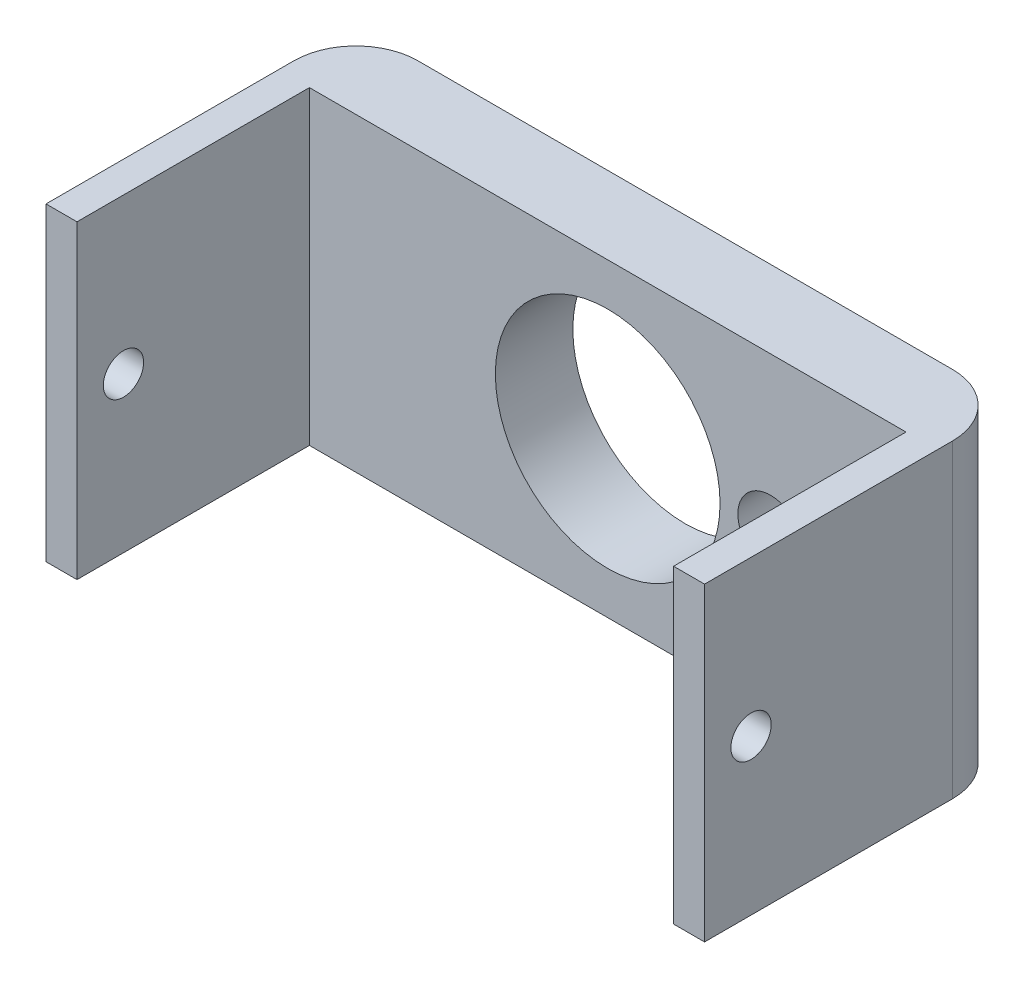
ISO-10303-21;
HEADER;
FILE_DESCRIPTION(('STEP AP214'),'2;1');
FILE_NAME('part.step','',(''),(''),'','','');
FILE_SCHEMA(('AUTOMOTIVE_DESIGN { 1 0 10303 214 1 1 1 1 }'));
ENDSEC;
DATA;
#1=APPLICATION_CONTEXT('core data for automotive mechanical design processes');
#2=APPLICATION_PROTOCOL_DEFINITION('international standard','automotive_design',2000,#1);
#3=PRODUCT_CONTEXT('',#1,'mechanical');
#4=PRODUCT('Part','Part','',(#3));
#5=PRODUCT_RELATED_PRODUCT_CATEGORY('part','',(#4));
#6=PRODUCT_DEFINITION_FORMATION('','',#4);
#7=PRODUCT_DEFINITION_CONTEXT('part definition',#1,'design');
#8=PRODUCT_DEFINITION('design','',#6,#7);
#9=PRODUCT_DEFINITION_SHAPE('','',#8);
#10=(LENGTH_UNIT() NAMED_UNIT(*) SI_UNIT(.MILLI.,.METRE.));
#11=(NAMED_UNIT(*) PLANE_ANGLE_UNIT() SI_UNIT($,.RADIAN.));
#12=(NAMED_UNIT(*) SI_UNIT($,.STERADIAN.) SOLID_ANGLE_UNIT());
#13=UNCERTAINTY_MEASURE_WITH_UNIT(LENGTH_MEASURE(1.E-05),#10,'distance_accuracy_value','');
#14=(GEOMETRIC_REPRESENTATION_CONTEXT(3) GLOBAL_UNCERTAINTY_ASSIGNED_CONTEXT((#13)) GLOBAL_UNIT_ASSIGNED_CONTEXT((#10,
#11,#12)) REPRESENTATION_CONTEXT('',''));
#15=CARTESIAN_POINT('',(0.,0.,0.));
#16=DIRECTION('',(0.,0.,1.));
#17=DIRECTION('',(1.,0.,0.));
#18=AXIS2_PLACEMENT_3D('',#15,#16,#17);
#19=CARTESIAN_POINT('',(0.,0.,20.));
#20=DIRECTION('',(0.,0.,-1.));
#21=DIRECTION('',(-1.,0.,0.));
#22=AXIS2_PLACEMENT_3D('',#19,#20,#21);
#23=PLANE('',#22);
#24=DIRECTION('',(-1.,0.,0.));
#25=VECTOR('',#24,1.);
#26=CARTESIAN_POINT('',(-21.25,10.,20.));
#27=LINE('',#26,#25);
#28=CARTESIAN_POINT('',(21.25,10.,20.));
#29=VERTEX_POINT('',#28);
#30=CARTESIAN_POINT('',(19.25,10.,20.));
#31=VERTEX_POINT('',#30);
#32=EDGE_CURVE('E167',#29,#31,#27,.T.);
#33=ORIENTED_EDGE('',*,*,#32,.T.);
#34=DIRECTION('',(0.,1.,0.));
#35=VECTOR('',#34,1.);
#36=CARTESIAN_POINT('',(19.25,10.,20.));
#37=LINE('',#36,#35);
#38=CARTESIAN_POINT('',(19.25,-10.,20.));
#39=VERTEX_POINT('',#38);
#40=EDGE_CURVE('E145',#39,#31,#37,.T.);
#41=ORIENTED_EDGE('',*,*,#40,.F.);
#42=DIRECTION('',(1.,0.,0.));
#43=VECTOR('',#42,1.);
#44=CARTESIAN_POINT('',(-21.25,-10.,20.));
#45=LINE('',#44,#43);
#46=CARTESIAN_POINT('',(21.25,-10.,20.));
#47=VERTEX_POINT('',#46);
#48=EDGE_CURVE('E151',#39,#47,#45,.T.);
#49=ORIENTED_EDGE('',*,*,#48,.T.);
#50=DIRECTION('',(0.,1.,0.));
#51=VECTOR('',#50,1.);
#52=CARTESIAN_POINT('',(21.25,-10.,20.));
#53=LINE('',#52,#51);
#54=EDGE_CURVE('E161',#47,#29,#53,.T.);
#55=ORIENTED_EDGE('',*,*,#54,.T.);
#56=EDGE_LOOP('',(#33,#41,#49,#55));
#57=FACE_BOUND('',#56,.T.);
#58=ADVANCED_FACE('F45',(#57),#23,.F.);
#59=CARTESIAN_POINT('',(21.25,-10.,20.));
#60=DIRECTION('',(-1.,0.,0.));
#61=DIRECTION('',(0.,0.,1.));
#62=AXIS2_PLACEMENT_3D('',#59,#60,#61);
#63=PLANE('',#62);
#64=CARTESIAN_POINT('',(21.25,0.,17.));
#65=DIRECTION('',(1.,0.,0.));
#66=DIRECTION('',(0.,0.,-1.));
#67=AXIS2_PLACEMENT_3D('',#64,#65,#66);
#68=CIRCLE('',#67,1.3);
#69=CARTESIAN_POINT('',(21.25,0.,15.7));
#70=VERTEX_POINT('',#69);
#71=EDGE_CURVE('E277',#70,#70,#68,.T.);
#72=ORIENTED_EDGE('',*,*,#71,.F.);
#73=EDGE_LOOP('',(#72));
#74=FACE_BOUND('',#73,.T.);
#75=DIRECTION('',(0.,0.,-1.));
#76=VECTOR('',#75,1.);
#77=CARTESIAN_POINT('',(21.25,-10.,20.));
#78=LINE('',#77,#76);
#79=CARTESIAN_POINT('',(21.25,-10.,4.));
#80=VERTEX_POINT('',#79);
#81=EDGE_CURVE('E178',#47,#80,#78,.T.);
#82=ORIENTED_EDGE('',*,*,#81,.T.);
#83=DIRECTION('',(0.,1.,0.));
#84=VECTOR('',#83,1.);
#85=CARTESIAN_POINT('',(21.25,10.,4.));
#86=LINE('',#85,#84);
#87=CARTESIAN_POINT('',(21.25,10.,4.));
#88=VERTEX_POINT('',#87);
#89=EDGE_CURVE('E12',#80,#88,#86,.T.);
#90=ORIENTED_EDGE('',*,*,#89,.T.);
#91=DIRECTION('',(0.,0.,-1.));
#92=VECTOR('',#91,1.);
#93=CARTESIAN_POINT('',(21.25,10.,20.));
#94=LINE('',#93,#92);
#95=EDGE_CURVE('E194',#29,#88,#94,.T.);
#96=ORIENTED_EDGE('',*,*,#95,.F.);
#97=ORIENTED_EDGE('',*,*,#54,.F.);
#98=EDGE_LOOP('',(#82,#90,#96,#97));
#99=FACE_BOUND('',#98,.T.);
#100=ADVANCED_FACE('F238',(#74,#99),#63,.F.);
#101=CARTESIAN_POINT('',(-21.25,10.,20.));
#102=DIRECTION('',(0.,-1.,0.));
#103=DIRECTION('',(0.,0.,-1.));
#104=AXIS2_PLACEMENT_3D('',#101,#102,#103);
#105=PLANE('',#104);
#106=DIRECTION('',(-1.,0.,0.));
#107=VECTOR('',#106,1.);
#108=CARTESIAN_POINT('',(-21.25,10.,0.));
#109=LINE('',#108,#107);
#110=CARTESIAN_POINT('',(17.25,10.,0.));
#111=VERTEX_POINT('',#110);
#112=CARTESIAN_POINT('',(-17.25,10.,0.));
#113=VERTEX_POINT('',#112);
#114=EDGE_CURVE('E160',#111,#113,#109,.T.);
#115=ORIENTED_EDGE('',*,*,#114,.T.);
#116=CARTESIAN_POINT('',(-17.25,10.,4.));
#117=DIRECTION('',(0.,-1.,0.));
#118=DIRECTION('',(0.,0.,-1.));
#119=AXIS2_PLACEMENT_3D('',#116,#117,#118);
#120=CIRCLE('',#119,4.);
#121=CARTESIAN_POINT('',(-21.25,10.,4.));
#122=VERTEX_POINT('',#121);
#123=EDGE_CURVE('E54',#113,#122,#120,.F.);
#124=ORIENTED_EDGE('',*,*,#123,.T.);
#125=DIRECTION('',(0.,0.,-1.));
#126=VECTOR('',#125,1.);
#127=CARTESIAN_POINT('',(-21.25,10.,20.));
#128=LINE('',#127,#126);
#129=CARTESIAN_POINT('',(-21.25,10.,20.));
#130=VERTEX_POINT('',#129);
#131=EDGE_CURVE('E190',#130,#122,#128,.T.);
#132=ORIENTED_EDGE('',*,*,#131,.F.);
#133=CARTESIAN_POINT('',(-19.25,10.,20.));
#134=VERTEX_POINT('',#133);
#135=EDGE_CURVE('E165',#134,#130,#27,.T.);
#136=ORIENTED_EDGE('',*,*,#135,.F.);
#137=DIRECTION('',(0.,0.,1.));
#138=VECTOR('',#137,1.);
#139=CARTESIAN_POINT('',(-19.25,10.,-43.3849052090701));
#140=LINE('',#139,#138);
#141=CARTESIAN_POINT('',(-19.25,10.,5.));
#142=VERTEX_POINT('',#141);
#143=EDGE_CURVE('E245',#142,#134,#140,.T.);
#144=ORIENTED_EDGE('',*,*,#143,.F.);
#145=DIRECTION('',(-1.,0.,0.));
#146=VECTOR('',#145,1.);
#147=CARTESIAN_POINT('',(-19.25,10.,5.));
#148=LINE('',#147,#146);
#149=CARTESIAN_POINT('',(19.25,10.,5.));
#150=VERTEX_POINT('',#149);
#151=EDGE_CURVE('E248',#150,#142,#148,.T.);
#152=ORIENTED_EDGE('',*,*,#151,.F.);
#153=DIRECTION('',(0.,0.,1.));
#154=VECTOR('',#153,1.);
#155=CARTESIAN_POINT('',(19.25,10.,-43.3849052090701));
#156=LINE('',#155,#154);
#157=EDGE_CURVE('E131',#150,#31,#156,.T.);
#158=ORIENTED_EDGE('',*,*,#157,.T.);
#159=ORIENTED_EDGE('',*,*,#32,.F.);
#160=ORIENTED_EDGE('',*,*,#95,.T.);
#161=CARTESIAN_POINT('',(17.25,10.,4.));
#162=DIRECTION('',(0.,-1.,0.));
#163=DIRECTION('',(0.,0.,-1.));
#164=AXIS2_PLACEMENT_3D('',#161,#162,#163);
#165=CIRCLE('',#164,4.);
#166=EDGE_CURVE('E61',#88,#111,#165,.F.);
#167=ORIENTED_EDGE('',*,*,#166,.T.);
#168=EDGE_LOOP('',(#115,#124,#132,#136,#144,#152,#158,#159,#160,#167));
#169=FACE_BOUND('',#168,.T.);
#170=ADVANCED_FACE('F224',(#169),#105,.F.);
#171=CARTESIAN_POINT('',(-21.25,-10.,20.));
#172=DIRECTION('',(1.,0.,0.));
#173=DIRECTION('',(0.,0.,-1.));
#174=AXIS2_PLACEMENT_3D('',#171,#172,#173);
#175=PLANE('',#174);
#176=CARTESIAN_POINT('',(-21.25,0.,17.));
#177=DIRECTION('',(1.,0.,0.));
#178=DIRECTION('',(0.,0.,-1.));
#179=AXIS2_PLACEMENT_3D('',#176,#177,#178);
#180=CIRCLE('',#179,1.3);
#181=CARTESIAN_POINT('',(-21.25,0.,15.7));
#182=VERTEX_POINT('',#181);
#183=EDGE_CURVE('E204',#182,#182,#180,.F.);
#184=ORIENTED_EDGE('',*,*,#183,.F.);
#185=EDGE_LOOP('',(#184));
#186=FACE_BOUND('',#185,.T.);
#187=ORIENTED_EDGE('',*,*,#131,.T.);
#188=DIRECTION('',(0.,-1.,0.));
#189=VECTOR('',#188,1.);
#190=CARTESIAN_POINT('',(-21.25,-10.,4.));
#191=LINE('',#190,#189);
#192=CARTESIAN_POINT('',(-21.25,-10.,4.));
#193=VERTEX_POINT('',#192);
#194=EDGE_CURVE('E198',#122,#193,#191,.T.);
#195=ORIENTED_EDGE('',*,*,#194,.T.);
#196=DIRECTION('',(0.,0.,-1.));
#197=VECTOR('',#196,1.);
#198=CARTESIAN_POINT('',(-21.25,-10.,20.));
#199=LINE('',#198,#197);
#200=CARTESIAN_POINT('',(-21.25,-10.,20.));
#201=VERTEX_POINT('',#200);
#202=EDGE_CURVE('E187',#201,#193,#199,.T.);
#203=ORIENTED_EDGE('',*,*,#202,.F.);
#204=DIRECTION('',(0.,-1.,0.));
#205=VECTOR('',#204,1.);
#206=CARTESIAN_POINT('',(-21.25,-10.,20.));
#207=LINE('',#206,#205);
#208=EDGE_CURVE('E171',#130,#201,#207,.T.);
#209=ORIENTED_EDGE('',*,*,#208,.F.);
#210=EDGE_LOOP('',(#187,#195,#203,#209));
#211=FACE_BOUND('',#210,.T.);
#212=ADVANCED_FACE('F230',(#186,#211),#175,.F.);
#213=CARTESIAN_POINT('',(-21.25,-10.,20.));
#214=DIRECTION('',(0.,1.,0.));
#215=DIRECTION('',(0.,0.,1.));
#216=AXIS2_PLACEMENT_3D('',#213,#214,#215);
#217=PLANE('',#216);
#218=ORIENTED_EDGE('',*,*,#202,.T.);
#219=CARTESIAN_POINT('',(-17.25,-10.,4.));
#220=DIRECTION('',(0.,1.,0.));
#221=DIRECTION('',(0.,0.,1.));
#222=AXIS2_PLACEMENT_3D('',#219,#220,#221);
#223=CIRCLE('',#222,4.);
#224=CARTESIAN_POINT('',(-17.25,-10.,0.));
#225=VERTEX_POINT('',#224);
#226=EDGE_CURVE('E211',#193,#225,#223,.F.);
#227=ORIENTED_EDGE('',*,*,#226,.T.);
#228=DIRECTION('',(1.,0.,0.));
#229=VECTOR('',#228,1.);
#230=CARTESIAN_POINT('',(-21.25,-10.,0.));
#231=LINE('',#230,#229);
#232=CARTESIAN_POINT('',(17.25,-10.,0.));
#233=VERTEX_POINT('',#232);
#234=EDGE_CURVE('E166',#225,#233,#231,.T.);
#235=ORIENTED_EDGE('',*,*,#234,.T.);
#236=CARTESIAN_POINT('',(17.25,-10.,4.));
#237=DIRECTION('',(0.,1.,0.));
#238=DIRECTION('',(0.,0.,1.));
#239=AXIS2_PLACEMENT_3D('',#236,#237,#238);
#240=CIRCLE('',#239,4.);
#241=EDGE_CURVE('E208',#233,#80,#240,.F.);
#242=ORIENTED_EDGE('',*,*,#241,.T.);
#243=ORIENTED_EDGE('',*,*,#81,.F.);
#244=ORIENTED_EDGE('',*,*,#48,.F.);
#245=DIRECTION('',(0.,0.,1.));
#246=VECTOR('',#245,1.);
#247=CARTESIAN_POINT('',(19.25,-10.,-43.3849052090701));
#248=LINE('',#247,#246);
#249=CARTESIAN_POINT('',(19.25,-10.,5.));
#250=VERTEX_POINT('',#249);
#251=EDGE_CURVE('E128',#250,#39,#248,.T.);
#252=ORIENTED_EDGE('',*,*,#251,.F.);
#253=DIRECTION('',(1.,0.,0.));
#254=VECTOR('',#253,1.);
#255=CARTESIAN_POINT('',(-19.25,-10.,5.));
#256=LINE('',#255,#254);
#257=CARTESIAN_POINT('',(-19.25,-10.,5.));
#258=VERTEX_POINT('',#257);
#259=EDGE_CURVE('E138',#258,#250,#256,.T.);
#260=ORIENTED_EDGE('',*,*,#259,.F.);
#261=DIRECTION('',(0.,0.,1.));
#262=VECTOR('',#261,1.);
#263=CARTESIAN_POINT('',(-19.25,-10.,-43.3849052090701));
#264=LINE('',#263,#262);
#265=CARTESIAN_POINT('',(-19.25,-10.,20.));
#266=VERTEX_POINT('',#265);
#267=EDGE_CURVE('E157',#258,#266,#264,.T.);
#268=ORIENTED_EDGE('',*,*,#267,.T.);
#269=EDGE_CURVE('E174',#201,#266,#45,.T.);
#270=ORIENTED_EDGE('',*,*,#269,.F.);
#271=EDGE_LOOP('',(#218,#227,#235,#242,#243,#244,#252,#260,#268,#270));
#272=FACE_BOUND('',#271,.T.);
#273=ADVANCED_FACE('F149',(#272),#217,.F.);
#274=ORIENTED_EDGE('',*,*,#269,.T.);
#275=DIRECTION('',(0.,-1.,0.));
#276=VECTOR('',#275,1.);
#277=CARTESIAN_POINT('',(-19.25,10.,20.));
#278=LINE('',#277,#276);
#279=EDGE_CURVE('E255',#134,#266,#278,.T.);
#280=ORIENTED_EDGE('',*,*,#279,.F.);
#281=ORIENTED_EDGE('',*,*,#135,.T.);
#282=ORIENTED_EDGE('',*,*,#208,.T.);
#283=EDGE_LOOP('',(#274,#280,#281,#282));
#284=FACE_BOUND('',#283,.T.);
#285=ADVANCED_FACE('F257',(#284),#23,.F.);
#286=CARTESIAN_POINT('',(0.,0.,0.));
#287=DIRECTION('',(0.,0.,-1.));
#288=DIRECTION('',(-1.,0.,0.));
#289=AXIS2_PLACEMENT_3D('',#286,#287,#288);
#290=PLANE('',#289);
#291=CARTESIAN_POINT('',(10.5,0.,0.));
#292=DIRECTION('',(0.,0.,-1.));
#293=DIRECTION('',(-1.,0.,0.));
#294=AXIS2_PLACEMENT_3D('',#291,#292,#293);
#295=CIRCLE('',#294,2.1);
#296=CARTESIAN_POINT('',(8.4,0.,0.));
#297=VERTEX_POINT('',#296);
#298=EDGE_CURVE('E285',#297,#297,#295,.T.);
#299=ORIENTED_EDGE('',*,*,#298,.F.);
#300=EDGE_LOOP('',(#299));
#301=FACE_BOUND('',#300,.T.);
#302=CARTESIAN_POINT('',(0.,0.,0.));
#303=DIRECTION('',(0.,0.,-1.));
#304=DIRECTION('',(-1.,0.,0.));
#305=AXIS2_PLACEMENT_3D('',#302,#303,#304);
#306=CIRCLE('',#305,7.25);
#307=CARTESIAN_POINT('',(-7.25,0.,0.));
#308=VERTEX_POINT('',#307);
#309=EDGE_CURVE('E265',#308,#308,#306,.T.);
#310=ORIENTED_EDGE('',*,*,#309,.F.);
#311=EDGE_LOOP('',(#310));
#312=FACE_BOUND('',#311,.T.);
#313=ORIENTED_EDGE('',*,*,#234,.F.);
#314=DIRECTION('',(0.,-1.,0.));
#315=VECTOR('',#314,1.);
#316=CARTESIAN_POINT('',(-17.25,10.,0.));
#317=LINE('',#316,#315);
#318=EDGE_CURVE('E68',#225,#113,#317,.F.);
#319=ORIENTED_EDGE('',*,*,#318,.T.);
#320=ORIENTED_EDGE('',*,*,#114,.F.);
#321=DIRECTION('',(0.,1.,0.));
#322=VECTOR('',#321,1.);
#323=CARTESIAN_POINT('',(17.25,-10.,0.));
#324=LINE('',#323,#322);
#325=EDGE_CURVE('E214',#111,#233,#324,.F.);
#326=ORIENTED_EDGE('',*,*,#325,.T.);
#327=EDGE_LOOP('',(#313,#319,#320,#326));
#328=FACE_BOUND('',#327,.T.);
#329=ADVANCED_FACE('F235',(#301,#312,#328),#290,.T.);
#330=CARTESIAN_POINT('',(0.,0.,5.));
#331=DIRECTION('',(0.,0.,-1.));
#332=DIRECTION('',(-1.,0.,0.));
#333=AXIS2_PLACEMENT_3D('',#330,#331,#332);
#334=PLANE('',#333);
#335=CARTESIAN_POINT('',(10.5,0.,5.));
#336=DIRECTION('',(0.,0.,-1.));
#337=DIRECTION('',(-1.,0.,0.));
#338=AXIS2_PLACEMENT_3D('',#335,#336,#337);
#339=CIRCLE('',#338,2.1);
#340=CARTESIAN_POINT('',(8.4,0.,5.));
#341=VERTEX_POINT('',#340);
#342=EDGE_CURVE('E281',#341,#341,#339,.F.);
#343=ORIENTED_EDGE('',*,*,#342,.F.);
#344=EDGE_LOOP('',(#343));
#345=FACE_BOUND('',#344,.T.);
#346=CARTESIAN_POINT('',(0.,0.,5.));
#347=DIRECTION('',(0.,0.,-1.));
#348=DIRECTION('',(-1.,0.,0.));
#349=AXIS2_PLACEMENT_3D('',#346,#347,#348);
#350=CIRCLE('',#349,7.25);
#351=CARTESIAN_POINT('',(-7.25,0.,5.));
#352=VERTEX_POINT('',#351);
#353=EDGE_CURVE('E259',#352,#352,#350,.F.);
#354=ORIENTED_EDGE('',*,*,#353,.F.);
#355=EDGE_LOOP('',(#354));
#356=FACE_BOUND('',#355,.T.);
#357=DIRECTION('',(0.,-1.,0.));
#358=VECTOR('',#357,1.);
#359=CARTESIAN_POINT('',(-19.25,10.,5.));
#360=LINE('',#359,#358);
#361=EDGE_CURVE('E140',#142,#258,#360,.T.);
#362=ORIENTED_EDGE('',*,*,#361,.T.);
#363=ORIENTED_EDGE('',*,*,#259,.T.);
#364=DIRECTION('',(0.,1.,0.));
#365=VECTOR('',#364,1.);
#366=CARTESIAN_POINT('',(19.25,10.,5.));
#367=LINE('',#366,#365);
#368=EDGE_CURVE('E124',#250,#150,#367,.T.);
#369=ORIENTED_EDGE('',*,*,#368,.T.);
#370=ORIENTED_EDGE('',*,*,#151,.T.);
#371=EDGE_LOOP('',(#362,#363,#369,#370));
#372=FACE_BOUND('',#371,.T.);
#373=ADVANCED_FACE('F139',(#345,#356,#372),#334,.F.);
#374=CARTESIAN_POINT('',(19.25,10.,-43.3849052090701));
#375=DIRECTION('',(1.,0.,0.));
#376=DIRECTION('',(0.,0.,-1.));
#377=AXIS2_PLACEMENT_3D('',#374,#375,#376);
#378=PLANE('',#377);
#379=CARTESIAN_POINT('',(19.25,0.,17.));
#380=DIRECTION('',(1.,0.,0.));
#381=DIRECTION('',(0.,0.,-1.));
#382=AXIS2_PLACEMENT_3D('',#379,#380,#381);
#383=CIRCLE('',#382,1.3);
#384=CARTESIAN_POINT('',(19.25,0.,15.7));
#385=VERTEX_POINT('',#384);
#386=EDGE_CURVE('E203',#385,#385,#383,.T.);
#387=ORIENTED_EDGE('',*,*,#386,.T.);
#388=EDGE_LOOP('',(#387));
#389=FACE_BOUND('',#388,.T.);
#390=ORIENTED_EDGE('',*,*,#251,.T.);
#391=ORIENTED_EDGE('',*,*,#40,.T.);
#392=ORIENTED_EDGE('',*,*,#157,.F.);
#393=ORIENTED_EDGE('',*,*,#368,.F.);
#394=EDGE_LOOP('',(#390,#391,#392,#393));
#395=FACE_BOUND('',#394,.T.);
#396=ADVANCED_FACE('F126',(#389,#395),#378,.F.);
#397=CARTESIAN_POINT('',(-19.25,10.,-43.3849052090701));
#398=DIRECTION('',(-1.,0.,0.));
#399=DIRECTION('',(0.,-1.,0.));
#400=AXIS2_PLACEMENT_3D('',#397,#398,#399);
#401=PLANE('',#400);
#402=CARTESIAN_POINT('',(-19.25,0.,17.));
#403=DIRECTION('',(-1.,0.,0.));
#404=DIRECTION('',(0.,-1.,0.));
#405=AXIS2_PLACEMENT_3D('',#402,#403,#404);
#406=CIRCLE('',#405,1.3);
#407=CARTESIAN_POINT('',(-19.25,-1.3,17.));
#408=VERTEX_POINT('',#407);
#409=EDGE_CURVE('E199',#408,#408,#406,.T.);
#410=ORIENTED_EDGE('',*,*,#409,.T.);
#411=EDGE_LOOP('',(#410));
#412=FACE_BOUND('',#411,.T.);
#413=ORIENTED_EDGE('',*,*,#143,.T.);
#414=ORIENTED_EDGE('',*,*,#279,.T.);
#415=ORIENTED_EDGE('',*,*,#267,.F.);
#416=ORIENTED_EDGE('',*,*,#361,.F.);
#417=EDGE_LOOP('',(#413,#414,#415,#416));
#418=FACE_BOUND('',#417,.T.);
#419=ADVANCED_FACE('F254',(#412,#418),#401,.F.);
#420=CARTESIAN_POINT('',(0.,0.,25.5060966544099));
#421=DIRECTION('',(0.,0.,-1.));
#422=DIRECTION('',(-1.,0.,0.));
#423=AXIS2_PLACEMENT_3D('',#420,#421,#422);
#424=CYLINDRICAL_SURFACE('',#423,7.25);
#425=ORIENTED_EDGE('',*,*,#353,.T.);
#426=EDGE_LOOP('',(#425));
#427=FACE_BOUND('',#426,.T.);
#428=ORIENTED_EDGE('',*,*,#309,.T.);
#429=EDGE_LOOP('',(#428));
#430=FACE_BOUND('',#429,.T.);
#431=ADVANCED_FACE('F297',(#427,#430),#424,.F.);
#432=CARTESIAN_POINT('',(-24.92695526217,0.,17.));
#433=DIRECTION('',(1.,0.,0.));
#434=DIRECTION('',(0.,0.,-1.));
#435=AXIS2_PLACEMENT_3D('',#432,#433,#434);
#436=CYLINDRICAL_SURFACE('',#435,1.3);
#437=ORIENTED_EDGE('',*,*,#183,.T.);
#438=EDGE_LOOP('',(#437));
#439=FACE_BOUND('',#438,.T.);
#440=ORIENTED_EDGE('',*,*,#409,.F.);
#441=EDGE_LOOP('',(#440));
#442=FACE_BOUND('',#441,.T.);
#443=ADVANCED_FACE('F299',(#439,#442),#436,.F.);
#444=ORIENTED_EDGE('',*,*,#71,.T.);
#445=EDGE_LOOP('',(#444));
#446=FACE_BOUND('',#445,.T.);
#447=ORIENTED_EDGE('',*,*,#386,.F.);
#448=EDGE_LOOP('',(#447));
#449=FACE_BOUND('',#448,.T.);
#450=ADVANCED_FACE('F306',(#446,#449),#436,.F.);
#451=CARTESIAN_POINT('',(10.5,0.,10.939696961967));
#452=DIRECTION('',(0.,0.,-1.));
#453=DIRECTION('',(-1.,0.,0.));
#454=AXIS2_PLACEMENT_3D('',#451,#452,#453);
#455=CYLINDRICAL_SURFACE('',#454,2.1);
#456=CARTESIAN_POINT('',(8.4,0.,5.));
#457=CARTESIAN_POINT('',(8.4,0.,4.94791666666667));
#458=CARTESIAN_POINT('',(8.4,0.,4.89583333333333));
#459=CARTESIAN_POINT('',(8.4,0.,4.79166666666667));
#460=CARTESIAN_POINT('',(8.4,0.,4.73958333333333));
#461=CARTESIAN_POINT('',(8.4,0.,4.63541666666667));
#462=CARTESIAN_POINT('',(8.4,0.,4.58333333333333));
#463=CARTESIAN_POINT('',(8.4,0.,4.47916666666667));
#464=CARTESIAN_POINT('',(8.4,0.,4.42708333333333));
#465=CARTESIAN_POINT('',(8.4,0.,4.32291666666667));
#466=CARTESIAN_POINT('',(8.4,0.,4.27083333333333));
#467=CARTESIAN_POINT('',(8.4,0.,4.16666666666667));
#468=CARTESIAN_POINT('',(8.4,0.,4.11458333333333));
#469=CARTESIAN_POINT('',(8.4,0.,4.01041666666667));
#470=CARTESIAN_POINT('',(8.4,0.,3.95833333333333));
#471=CARTESIAN_POINT('',(8.4,0.,3.85416666666667));
#472=CARTESIAN_POINT('',(8.4,0.,3.80208333333333));
#473=CARTESIAN_POINT('',(8.4,0.,3.69791666666667));
#474=CARTESIAN_POINT('',(8.4,0.,3.64583333333333));
#475=CARTESIAN_POINT('',(8.4,0.,3.54166666666667));
#476=CARTESIAN_POINT('',(8.4,0.,3.48958333333333));
#477=CARTESIAN_POINT('',(8.4,0.,3.38541666666667));
#478=CARTESIAN_POINT('',(8.4,0.,3.33333333333333));
#479=CARTESIAN_POINT('',(8.4,0.,3.22916666666667));
#480=CARTESIAN_POINT('',(8.4,0.,3.17708333333333));
#481=CARTESIAN_POINT('',(8.4,0.,3.07291666666667));
#482=CARTESIAN_POINT('',(8.4,0.,3.02083333333333));
#483=CARTESIAN_POINT('',(8.4,0.,2.91666666666667));
#484=CARTESIAN_POINT('',(8.4,0.,2.86458333333333));
#485=CARTESIAN_POINT('',(8.4,0.,2.76041666666667));
#486=CARTESIAN_POINT('',(8.4,0.,2.70833333333333));
#487=CARTESIAN_POINT('',(8.4,0.,2.60416666666667));
#488=CARTESIAN_POINT('',(8.4,0.,2.55208333333333));
#489=CARTESIAN_POINT('',(8.4,0.,2.44791666666667));
#490=CARTESIAN_POINT('',(8.4,0.,2.39583333333333));
#491=CARTESIAN_POINT('',(8.4,0.,2.29166666666667));
#492=CARTESIAN_POINT('',(8.4,0.,2.23958333333333));
#493=CARTESIAN_POINT('',(8.4,0.,2.13541666666667));
#494=CARTESIAN_POINT('',(8.4,0.,2.08333333333334));
#495=CARTESIAN_POINT('',(8.4,0.,1.97916666666667));
#496=CARTESIAN_POINT('',(8.4,0.,1.92708333333334));
#497=CARTESIAN_POINT('',(8.4,0.,1.82291666666667));
#498=CARTESIAN_POINT('',(8.4,0.,1.77083333333334));
#499=CARTESIAN_POINT('',(8.4,0.,1.66666666666667));
#500=CARTESIAN_POINT('',(8.4,0.,1.61458333333333));
#501=CARTESIAN_POINT('',(8.4,0.,1.51041666666667));
#502=CARTESIAN_POINT('',(8.4,0.,1.45833333333333));
#503=CARTESIAN_POINT('',(8.4,0.,1.35416666666667));
#504=CARTESIAN_POINT('',(8.4,0.,1.30208333333333));
#505=CARTESIAN_POINT('',(8.4,0.,1.19791666666667));
#506=CARTESIAN_POINT('',(8.4,0.,1.14583333333333));
#507=CARTESIAN_POINT('',(8.4,0.,1.04166666666667));
#508=CARTESIAN_POINT('',(8.4,0.,0.989583333333335));
#509=CARTESIAN_POINT('',(8.4,0.,0.885416666666669));
#510=CARTESIAN_POINT('',(8.4,0.,0.833333333333336));
#511=CARTESIAN_POINT('',(8.4,0.,0.729166666666669));
#512=CARTESIAN_POINT('',(8.4,0.,0.677083333333336));
#513=CARTESIAN_POINT('',(8.4,0.,0.572916666666669));
#514=CARTESIAN_POINT('',(8.4,0.,0.520833333333335));
#515=CARTESIAN_POINT('',(8.4,0.,0.416666666666669));
#516=CARTESIAN_POINT('',(8.4,0.,0.364583333333335));
#517=CARTESIAN_POINT('',(8.4,0.,0.260416666666669));
#518=CARTESIAN_POINT('',(8.4,0.,0.208333333333335));
#519=CARTESIAN_POINT('',(8.4,0.,0.104166666666669));
#520=CARTESIAN_POINT('',(8.4,0.,0.0520833333333352));
#521=CARTESIAN_POINT('',(8.4,0.,0.));
#522=B_SPLINE_CURVE_WITH_KNOTS('',3,(#456,#457,#458,#459,#460,#461,#462,#463,#464,#465,#466,
#467,#468,#469,#470,#471,#472,#473,#474,#475,#476,#477,#478,#479,#480,#481,#482,#483,#484,#485,
#486,#487,#488,#489,#490,#491,#492,#493,#494,#495,#496,#497,#498,#499,#500,#501,#502,#503,#504,
#505,#506,#507,#508,#509,#510,#511,#512,#513,#514,#515,#516,#517,#518,#519,#520,#521),
.UNSPECIFIED.,.F.,.F.,(4,2,2,2,2,2,2,2,2,2,2,2,2,2,2,2,2,2,2,2,2,2,2,2,2,2,2,2,2,2,2,2,4),(0.,
0.15625,0.3125,0.46875,0.625,0.78125,0.9375,1.09375,1.25,1.40625,1.5625,1.71875,1.875,2.03125,
2.1875,2.34375,2.5,2.65625,2.8125,2.96875,3.125,3.28125,3.4375,3.59375,3.75,3.90625,4.0625,
4.21875,4.375,4.53125,4.6875,4.84375,5.),.UNSPECIFIED.);
#523=EDGE_CURVE('BSEAM290',#341,#297,#522,.T.);
#524=ORIENTED_EDGE('',*,*,#342,.T.);
#525=ORIENTED_EDGE('',*,*,#298,.T.);
#526=ORIENTED_EDGE('',*,*,#523,.T.);
#527=ORIENTED_EDGE('',*,*,#523,.F.);
#528=EDGE_LOOP('',(#524,#526,#525,#527));
#529=FACE_BOUND('',#528,.T.);
#530=ADVANCED_FACE('F290',(#529),#455,.F.);
#531=CARTESIAN_POINT('',(-17.25,-10.,4.));
#532=DIRECTION('',(0.,1.,0.));
#533=DIRECTION('',(0.,0.,1.));
#534=AXIS2_PLACEMENT_3D('',#531,#532,#533);
#535=CYLINDRICAL_SURFACE('',#534,4.);
#536=ORIENTED_EDGE('',*,*,#123,.F.);
#537=ORIENTED_EDGE('',*,*,#318,.F.);
#538=ORIENTED_EDGE('',*,*,#226,.F.);
#539=ORIENTED_EDGE('',*,*,#194,.F.);
#540=EDGE_LOOP('',(#536,#537,#538,#539));
#541=FACE_BOUND('',#540,.T.);
#542=ADVANCED_FACE('F232',(#541),#535,.T.);
#543=CARTESIAN_POINT('',(17.25,-10.,4.));
#544=DIRECTION('',(0.,-1.,0.));
#545=DIRECTION('',(0.,0.,-1.));
#546=AXIS2_PLACEMENT_3D('',#543,#544,#545);
#547=CYLINDRICAL_SURFACE('',#546,4.);
#548=ORIENTED_EDGE('',*,*,#241,.F.);
#549=ORIENTED_EDGE('',*,*,#325,.F.);
#550=ORIENTED_EDGE('',*,*,#166,.F.);
#551=ORIENTED_EDGE('',*,*,#89,.F.);
#552=EDGE_LOOP('',(#548,#549,#550,#551));
#553=FACE_BOUND('',#552,.T.);
#554=ADVANCED_FACE('F47',(#553),#547,.T.);
#555=CLOSED_SHELL('',(#58,#100,#170,#212,#273,#285,#329,#373,#396,#419,#431,#443,#450,#530,#542,#554));
#556=MANIFOLD_SOLID_BREP('B2',#555);
#557=ADVANCED_BREP_SHAPE_REPRESENTATION('',(#18,#556),#14);
#558=SHAPE_DEFINITION_REPRESENTATION(#9,#557);
ENDSEC;
END-ISO-10303-21;
